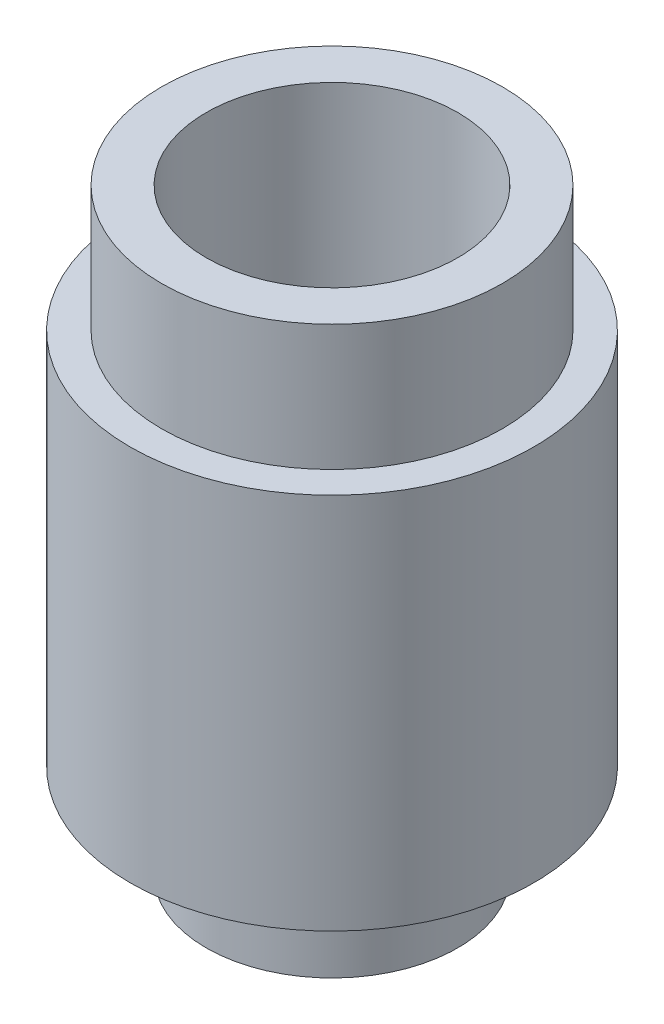
ISO-10303-21;
HEADER;
FILE_DESCRIPTION(('STEP AP214'),'2;1');
FILE_NAME('part.step','',(''),(''),'','','');
FILE_SCHEMA(('AUTOMOTIVE_DESIGN { 1 0 10303 214 1 1 1 1 }'));
ENDSEC;
DATA;
#1=APPLICATION_CONTEXT('core data for automotive mechanical design processes');
#2=APPLICATION_PROTOCOL_DEFINITION('international standard','automotive_design',2000,#1);
#3=PRODUCT_CONTEXT('',#1,'mechanical');
#4=PRODUCT('Part','Part','',(#3));
#5=PRODUCT_RELATED_PRODUCT_CATEGORY('part','',(#4));
#6=PRODUCT_DEFINITION_FORMATION('','',#4);
#7=PRODUCT_DEFINITION_CONTEXT('part definition',#1,'design');
#8=PRODUCT_DEFINITION('design','',#6,#7);
#9=PRODUCT_DEFINITION_SHAPE('','',#8);
#10=(LENGTH_UNIT() NAMED_UNIT(*) SI_UNIT(.MILLI.,.METRE.));
#11=(NAMED_UNIT(*) PLANE_ANGLE_UNIT() SI_UNIT($,.RADIAN.));
#12=(NAMED_UNIT(*) SI_UNIT($,.STERADIAN.) SOLID_ANGLE_UNIT());
#13=UNCERTAINTY_MEASURE_WITH_UNIT(LENGTH_MEASURE(1.E-05),#10,'distance_accuracy_value','');
#14=(GEOMETRIC_REPRESENTATION_CONTEXT(3) GLOBAL_UNCERTAINTY_ASSIGNED_CONTEXT((#13)) GLOBAL_UNIT_ASSIGNED_CONTEXT((#10,
#11,#12)) REPRESENTATION_CONTEXT('',''));
#15=CARTESIAN_POINT('',(0.,0.,0.));
#16=DIRECTION('',(0.,0.,1.));
#17=DIRECTION('',(1.,0.,0.));
#18=AXIS2_PLACEMENT_3D('',#15,#16,#17);
#19=CARTESIAN_POINT('',(0.,1.6,0.));
#20=DIRECTION('',(0.,1.,0.));
#21=DIRECTION('',(0.,0.,1.));
#22=AXIS2_PLACEMENT_3D('',#19,#20,#21);
#23=CYLINDRICAL_SURFACE('',#22,2.4);
#24=CARTESIAN_POINT('',(0.,9.6,0.));
#25=DIRECTION('',(0.,1.,0.));
#26=DIRECTION('',(0.,0.,1.));
#27=AXIS2_PLACEMENT_3D('',#24,#25,#26);
#28=CIRCLE('',#27,2.4);
#29=CARTESIAN_POINT('',(0.,9.6,2.4));
#30=VERTEX_POINT('',#29);
#31=EDGE_CURVE('E65',#30,#30,#28,.T.);
#32=ORIENTED_EDGE('',*,*,#31,.T.);
#33=EDGE_LOOP('',(#32));
#34=FACE_BOUND('',#33,.T.);
#35=CARTESIAN_POINT('',(0.,3.8,0.));
#36=DIRECTION('',(0.,-1.,0.));
#37=DIRECTION('',(0.,0.,-1.));
#38=AXIS2_PLACEMENT_3D('',#35,#36,#37);
#39=CIRCLE('',#38,2.4);
#40=CARTESIAN_POINT('',(0.,3.8,-2.4));
#41=VERTEX_POINT('',#40);
#42=EDGE_CURVE('E10',#41,#41,#39,.F.);
#43=ORIENTED_EDGE('',*,*,#42,.F.);
#44=EDGE_LOOP('',(#43));
#45=FACE_BOUND('',#44,.T.);
#46=ADVANCED_FACE('F37',(#34,#45),#23,.F.);
#47=CARTESIAN_POINT('',(0.,7.2,0.));
#48=DIRECTION('',(0.,-1.,0.));
#49=DIRECTION('',(0.,0.,-1.));
#50=AXIS2_PLACEMENT_3D('',#47,#48,#49);
#51=CYLINDRICAL_SURFACE('',#50,3.85);
#52=CARTESIAN_POINT('',(0.,7.2,0.));
#53=DIRECTION('',(0.,1.,0.));
#54=DIRECTION('',(0.,0.,1.));
#55=AXIS2_PLACEMENT_3D('',#52,#53,#54);
#56=CIRCLE('',#55,3.85);
#57=CARTESIAN_POINT('',(0.,7.2,3.85));
#58=VERTEX_POINT('',#57);
#59=EDGE_CURVE('E50',#58,#58,#56,.T.);
#60=ORIENTED_EDGE('',*,*,#59,.F.);
#61=EDGE_LOOP('',(#60));
#62=FACE_BOUND('',#61,.T.);
#63=CARTESIAN_POINT('',(0.,0.,0.));
#64=DIRECTION('',(0.,1.,0.));
#65=DIRECTION('',(0.,0.,1.));
#66=AXIS2_PLACEMENT_3D('',#63,#64,#65);
#67=CIRCLE('',#66,3.85);
#68=CARTESIAN_POINT('',(0.,0.,3.85));
#69=VERTEX_POINT('',#68);
#70=EDGE_CURVE('E55',#69,#69,#67,.T.);
#71=ORIENTED_EDGE('',*,*,#70,.T.);
#72=EDGE_LOOP('',(#71));
#73=FACE_BOUND('',#72,.T.);
#74=ADVANCED_FACE('F39',(#62,#73),#51,.T.);
#75=CARTESIAN_POINT('',(0.,7.2,0.));
#76=DIRECTION('',(0.,1.,0.));
#77=DIRECTION('',(0.,0.,1.));
#78=AXIS2_PLACEMENT_3D('',#75,#76,#77);
#79=PLANE('',#78);
#80=CARTESIAN_POINT('',(0.,7.2,0.));
#81=DIRECTION('',(0.,1.,0.));
#82=DIRECTION('',(0.,0.,1.));
#83=AXIS2_PLACEMENT_3D('',#80,#81,#82);
#84=CIRCLE('',#83,3.25);
#85=CARTESIAN_POINT('',(0.,7.2,3.25));
#86=VERTEX_POINT('',#85);
#87=EDGE_CURVE('E45',#86,#86,#84,.T.);
#88=ORIENTED_EDGE('',*,*,#87,.F.);
#89=EDGE_LOOP('',(#88));
#90=FACE_BOUND('',#89,.T.);
#91=ORIENTED_EDGE('',*,*,#59,.T.);
#92=EDGE_LOOP('',(#91));
#93=FACE_BOUND('',#92,.T.);
#94=ADVANCED_FACE('F109',(#90,#93),#79,.T.);
#95=CARTESIAN_POINT('',(0.,0.,0.));
#96=DIRECTION('',(0.,1.,0.));
#97=DIRECTION('',(0.,0.,1.));
#98=AXIS2_PLACEMENT_3D('',#95,#96,#97);
#99=PLANE('',#98);
#100=CARTESIAN_POINT('',(0.,0.,0.));
#101=DIRECTION('',(0.,1.,0.));
#102=DIRECTION('',(0.,0.,1.));
#103=AXIS2_PLACEMENT_3D('',#100,#101,#102);
#104=CIRCLE('',#103,2.4);
#105=CARTESIAN_POINT('',(0.,0.,2.4));
#106=VERTEX_POINT('',#105);
#107=EDGE_CURVE('E69',#106,#106,#104,.T.);
#108=ORIENTED_EDGE('',*,*,#107,.T.);
#109=EDGE_LOOP('',(#108));
#110=FACE_BOUND('',#109,.T.);
#111=ORIENTED_EDGE('',*,*,#70,.F.);
#112=EDGE_LOOP('',(#111));
#113=FACE_BOUND('',#112,.T.);
#114=ADVANCED_FACE('F120',(#110,#113),#99,.F.);
#115=CARTESIAN_POINT('',(0.,1.6,0.));
#116=DIRECTION('',(0.,1.,0.));
#117=DIRECTION('',(0.,0.,1.));
#118=AXIS2_PLACEMENT_3D('',#115,#116,#117);
#119=CYLINDRICAL_SURFACE('',#118,3.25);
#120=ORIENTED_EDGE('',*,*,#87,.T.);
#121=EDGE_LOOP('',(#120));
#122=FACE_BOUND('',#121,.T.);
#123=CARTESIAN_POINT('',(0.,9.6,0.));
#124=DIRECTION('',(0.,1.,0.));
#125=DIRECTION('',(0.,0.,1.));
#126=AXIS2_PLACEMENT_3D('',#123,#124,#125);
#127=CIRCLE('',#126,3.25);
#128=CARTESIAN_POINT('',(0.,9.6,3.25));
#129=VERTEX_POINT('',#128);
#130=EDGE_CURVE('E60',#129,#129,#127,.T.);
#131=ORIENTED_EDGE('',*,*,#130,.F.);
#132=EDGE_LOOP('',(#131));
#133=FACE_BOUND('',#132,.T.);
#134=ADVANCED_FACE('F116',(#122,#133),#119,.T.);
#135=CARTESIAN_POINT('',(0.,9.6,0.));
#136=DIRECTION('',(0.,1.,0.));
#137=DIRECTION('',(0.,0.,1.));
#138=AXIS2_PLACEMENT_3D('',#135,#136,#137);
#139=PLANE('',#138);
#140=ORIENTED_EDGE('',*,*,#31,.F.);
#141=EDGE_LOOP('',(#140));
#142=FACE_BOUND('',#141,.T.);
#143=ORIENTED_EDGE('',*,*,#130,.T.);
#144=EDGE_LOOP('',(#143));
#145=FACE_BOUND('',#144,.T.);
#146=ADVANCED_FACE('F113',(#142,#145),#139,.T.);
#147=CARTESIAN_POINT('',(0.,3.8,0.));
#148=DIRECTION('',(0.,-1.,0.));
#149=DIRECTION('',(0.,0.,-1.));
#150=AXIS2_PLACEMENT_3D('',#147,#148,#149);
#151=PLANE('',#150);
#152=CARTESIAN_POINT('',(0.,3.8,0.));
#153=DIRECTION('',(0.,-1.,0.));
#154=DIRECTION('',(0.,0.,-1.));
#155=AXIS2_PLACEMENT_3D('',#152,#153,#154);
#156=CIRCLE('',#155,1.7);
#157=CARTESIAN_POINT('',(0.,3.8,-1.7));
#158=VERTEX_POINT('',#157);
#159=EDGE_CURVE('E77',#158,#158,#156,.T.);
#160=ORIENTED_EDGE('',*,*,#159,.T.);
#161=EDGE_LOOP('',(#160));
#162=FACE_BOUND('',#161,.T.);
#163=ORIENTED_EDGE('',*,*,#42,.T.);
#164=EDGE_LOOP('',(#163));
#165=FACE_BOUND('',#164,.T.);
#166=ADVANCED_FACE('F86',(#162,#165),#151,.F.);
#167=CARTESIAN_POINT('',(0.,3.8,0.));
#168=DIRECTION('',(0.,-1.,0.));
#169=DIRECTION('',(0.,0.,-1.));
#170=AXIS2_PLACEMENT_3D('',#167,#168,#169);
#171=CYLINDRICAL_SURFACE('',#170,2.4);
#172=CARTESIAN_POINT('',(0.,-1.8,0.));
#173=DIRECTION('',(0.,-1.,0.));
#174=DIRECTION('',(0.,0.,-1.));
#175=AXIS2_PLACEMENT_3D('',#172,#173,#174);
#176=CIRCLE('',#175,2.4);
#177=CARTESIAN_POINT('',(0.,-1.8,-2.4));
#178=VERTEX_POINT('',#177);
#179=EDGE_CURVE('E73',#178,#178,#176,.T.);
#180=ORIENTED_EDGE('',*,*,#179,.F.);
#181=EDGE_LOOP('',(#180));
#182=FACE_BOUND('',#181,.T.);
#183=ORIENTED_EDGE('',*,*,#107,.F.);
#184=EDGE_LOOP('',(#183));
#185=FACE_BOUND('',#184,.T.);
#186=ADVANCED_FACE('F91',(#182,#185),#171,.T.);
#187=CARTESIAN_POINT('',(0.,3.8,0.));
#188=DIRECTION('',(0.,-1.,0.));
#189=DIRECTION('',(0.,0.,-1.));
#190=AXIS2_PLACEMENT_3D('',#187,#188,#189);
#191=CYLINDRICAL_SURFACE('',#190,1.7);
#192=CARTESIAN_POINT('',(0.,-1.8,0.));
#193=DIRECTION('',(0.,-1.,0.));
#194=DIRECTION('',(0.,0.,-1.));
#195=AXIS2_PLACEMENT_3D('',#192,#193,#194);
#196=CIRCLE('',#195,1.7);
#197=CARTESIAN_POINT('',(0.,-1.8,-1.7));
#198=VERTEX_POINT('',#197);
#199=EDGE_CURVE('E78',#198,#198,#196,.T.);
#200=ORIENTED_EDGE('',*,*,#199,.T.);
#201=EDGE_LOOP('',(#200));
#202=FACE_BOUND('',#201,.T.);
#203=ORIENTED_EDGE('',*,*,#159,.F.);
#204=EDGE_LOOP('',(#203));
#205=FACE_BOUND('',#204,.T.);
#206=ADVANCED_FACE('F88',(#202,#205),#191,.F.);
#207=CARTESIAN_POINT('',(0.,-1.8,0.));
#208=DIRECTION('',(0.,-1.,0.));
#209=DIRECTION('',(0.,0.,-1.));
#210=AXIS2_PLACEMENT_3D('',#207,#208,#209);
#211=PLANE('',#210);
#212=ORIENTED_EDGE('',*,*,#199,.F.);
#213=EDGE_LOOP('',(#212));
#214=FACE_BOUND('',#213,.T.);
#215=ORIENTED_EDGE('',*,*,#179,.T.);
#216=EDGE_LOOP('',(#215));
#217=FACE_BOUND('',#216,.T.);
#218=ADVANCED_FACE('F90',(#214,#217),#211,.T.);
#219=CLOSED_SHELL('',(#46,#74,#94,#114,#134,#146,#166,#186,#206,#218));
#220=MANIFOLD_SOLID_BREP('B2',#219);
#221=ADVANCED_BREP_SHAPE_REPRESENTATION('',(#18,#220),#14);
#222=SHAPE_DEFINITION_REPRESENTATION(#9,#221);
ENDSEC;
END-ISO-10303-21;
